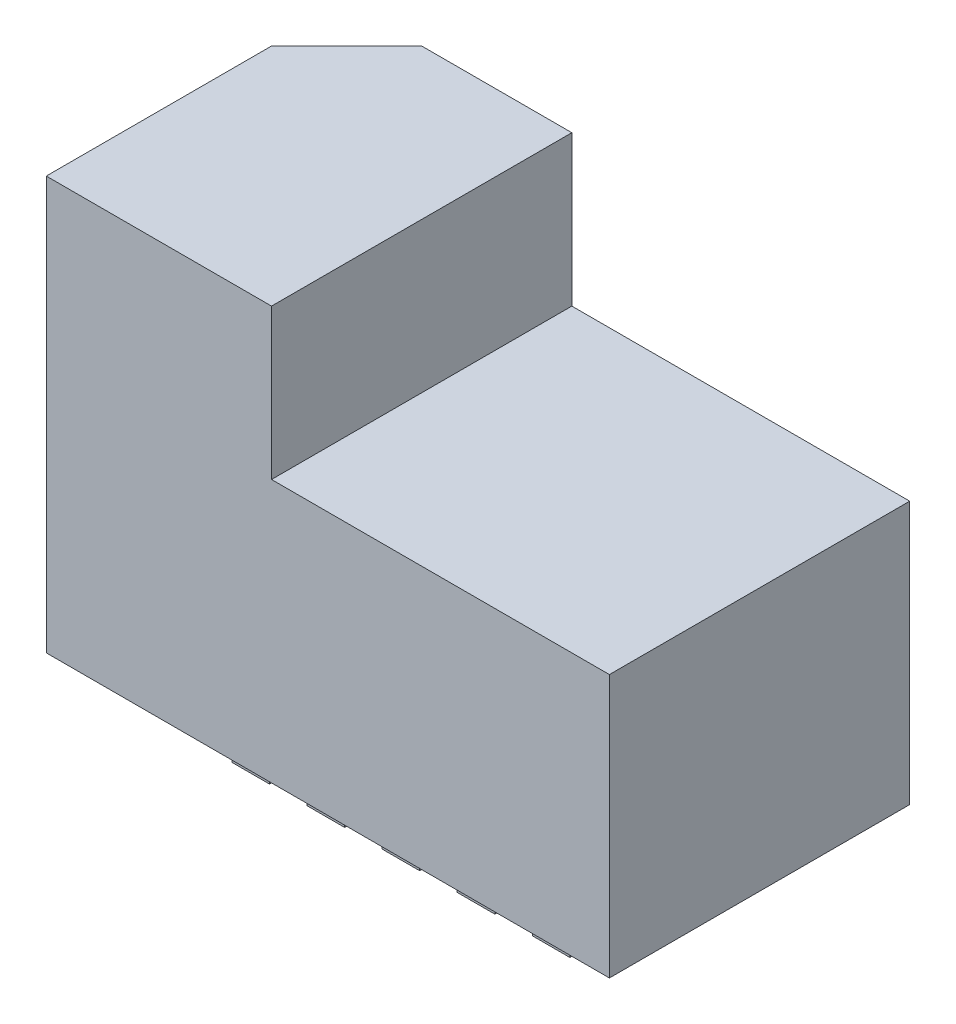
ISO-10303-21;
HEADER;
FILE_DESCRIPTION(('STEP AP214'),'2;1');
FILE_NAME('part.step','',(''),(''),'','','');
FILE_SCHEMA(('AUTOMOTIVE_DESIGN { 1 0 10303 214 1 1 1 1 }'));
ENDSEC;
DATA;
#1=APPLICATION_CONTEXT('core data for automotive mechanical design processes');
#2=APPLICATION_PROTOCOL_DEFINITION('international standard','automotive_design',2000,#1);
#3=PRODUCT_CONTEXT('',#1,'mechanical');
#4=PRODUCT('Part','Part','',(#3));
#5=PRODUCT_RELATED_PRODUCT_CATEGORY('part','',(#4));
#6=PRODUCT_DEFINITION_FORMATION('','',#4);
#7=PRODUCT_DEFINITION_CONTEXT('part definition',#1,'design');
#8=PRODUCT_DEFINITION('design','',#6,#7);
#9=PRODUCT_DEFINITION_SHAPE('','',#8);
#10=(LENGTH_UNIT() NAMED_UNIT(*) SI_UNIT(.MILLI.,.METRE.));
#11=(NAMED_UNIT(*) PLANE_ANGLE_UNIT() SI_UNIT($,.RADIAN.));
#12=(NAMED_UNIT(*) SI_UNIT($,.STERADIAN.) SOLID_ANGLE_UNIT());
#13=UNCERTAINTY_MEASURE_WITH_UNIT(LENGTH_MEASURE(1.E-05),#10,'distance_accuracy_value','');
#14=(GEOMETRIC_REPRESENTATION_CONTEXT(3) GLOBAL_UNCERTAINTY_ASSIGNED_CONTEXT((#13)) GLOBAL_UNIT_ASSIGNED_CONTEXT((#10,
#11,#12)) REPRESENTATION_CONTEXT('',''));
#15=CARTESIAN_POINT('',(0.,0.,0.));
#16=DIRECTION('',(0.,0.,1.));
#17=DIRECTION('',(1.,0.,0.));
#18=AXIS2_PLACEMENT_3D('',#15,#16,#17);
#19=CARTESIAN_POINT('',(0.,0.,0.));
#20=DIRECTION('',(0.,1.,0.));
#21=DIRECTION('',(0.,0.,1.));
#22=AXIS2_PLACEMENT_3D('',#19,#20,#21);
#23=PLANE('',#22);
#24=DIRECTION('',(0.,0.,-1.));
#25=VECTOR('',#24,1.);
#26=CARTESIAN_POINT('',(63.5,0.,-6.01284212611901));
#27=LINE('',#26,#25);
#28=CARTESIAN_POINT('',(63.5,0.,-6.01284212611901));
#29=VERTEX_POINT('',#28);
#30=CARTESIAN_POINT('',(63.5,0.,-44.0360815397835));
#31=VERTEX_POINT('',#30);
#32=EDGE_CURVE('E233',#29,#31,#27,.T.);
#33=ORIENTED_EDGE('',*,*,#32,.F.);
#34=DIRECTION('',(-1.,0.,0.));
#35=VECTOR('',#34,1.);
#36=CARTESIAN_POINT('',(63.5,0.,-6.01284212611901));
#37=LINE('',#36,#35);
#38=CARTESIAN_POINT('',(69.85,0.,-6.01284212611901));
#39=VERTEX_POINT('',#38);
#40=EDGE_CURVE('E246',#39,#29,#37,.T.);
#41=ORIENTED_EDGE('',*,*,#40,.F.);
#42=DIRECTION('',(0.,0.,1.));
#43=VECTOR('',#42,1.);
#44=CARTESIAN_POINT('',(69.85,0.,-6.01284212611901));
#45=LINE('',#44,#43);
#46=CARTESIAN_POINT('',(69.85,0.,-44.0360815397834));
#47=VERTEX_POINT('',#46);
#48=EDGE_CURVE('E255',#47,#39,#45,.T.);
#49=ORIENTED_EDGE('',*,*,#48,.F.);
#50=DIRECTION('',(1.,0.,0.));
#51=VECTOR('',#50,1.);
#52=CARTESIAN_POINT('',(63.5,0.,-44.0360815397835));
#53=LINE('',#52,#51);
#54=EDGE_CURVE('E236',#31,#47,#53,.T.);
#55=ORIENTED_EDGE('',*,*,#54,.F.);
#56=EDGE_LOOP('',(#33,#41,#49,#55));
#57=FACE_BOUND('',#56,.T.);
#58=DIRECTION('',(0.,0.,-1.));
#59=VECTOR('',#58,1.);
#60=CARTESIAN_POINT('',(38.1,0.,-6.01284212611899));
#61=LINE('',#60,#59);
#62=CARTESIAN_POINT('',(38.1,0.,-6.01284212611899));
#63=VERTEX_POINT('',#62);
#64=CARTESIAN_POINT('',(38.1,0.,-44.0360815397834));
#65=VERTEX_POINT('',#64);
#66=EDGE_CURVE('E304',#63,#65,#61,.T.);
#67=ORIENTED_EDGE('',*,*,#66,.F.);
#68=DIRECTION('',(-1.,0.,0.));
#69=VECTOR('',#68,1.);
#70=CARTESIAN_POINT('',(38.1,0.,-6.01284212611899));
#71=LINE('',#70,#69);
#72=CARTESIAN_POINT('',(44.45,0.,-6.01284212611899));
#73=VERTEX_POINT('',#72);
#74=EDGE_CURVE('E309',#73,#63,#71,.T.);
#75=ORIENTED_EDGE('',*,*,#74,.F.);
#76=DIRECTION('',(0.,0.,1.));
#77=VECTOR('',#76,1.);
#78=CARTESIAN_POINT('',(44.45,0.,-6.01284212611899));
#79=LINE('',#78,#77);
#80=CARTESIAN_POINT('',(44.45,0.,-44.0360815397834));
#81=VERTEX_POINT('',#80);
#82=EDGE_CURVE('E321',#81,#73,#79,.T.);
#83=ORIENTED_EDGE('',*,*,#82,.F.);
#84=DIRECTION('',(1.,0.,0.));
#85=VECTOR('',#84,1.);
#86=CARTESIAN_POINT('',(38.1,0.,-44.0360815397834));
#87=LINE('',#86,#85);
#88=EDGE_CURVE('E318',#65,#81,#87,.T.);
#89=ORIENTED_EDGE('',*,*,#88,.F.);
#90=EDGE_LOOP('',(#67,#75,#83,#89));
#91=FACE_BOUND('',#90,.T.);
#92=DIRECTION('',(0.,0.,1.));
#93=VECTOR('',#92,1.);
#94=CARTESIAN_POINT('',(0.,0.,0.));
#95=LINE('',#94,#93);
#96=CARTESIAN_POINT('',(0.,0.,-38.1));
#97=VERTEX_POINT('',#96);
#98=CARTESIAN_POINT('',(0.,0.,0.));
#99=VERTEX_POINT('',#98);
#100=EDGE_CURVE('E389',#97,#99,#95,.T.);
#101=ORIENTED_EDGE('',*,*,#100,.F.);
#102=DIRECTION('',(-0.707106781186548,0.,0.707106781186547));
#103=VECTOR('',#102,1.);
#104=CARTESIAN_POINT('',(0.,0.,-38.1));
#105=LINE('',#104,#103);
#106=CARTESIAN_POINT('',(12.7,0.,-50.8));
#107=VERTEX_POINT('',#106);
#108=EDGE_CURVE('E394',#107,#97,#105,.T.);
#109=ORIENTED_EDGE('',*,*,#108,.F.);
#110=DIRECTION('',(-1.,0.,0.));
#111=VECTOR('',#110,1.);
#112=CARTESIAN_POINT('',(38.1,0.,-50.8));
#113=LINE('',#112,#111);
#114=CARTESIAN_POINT('',(95.25,0.,-50.8));
#115=VERTEX_POINT('',#114);
#116=EDGE_CURVE('E407',#115,#107,#113,.T.);
#117=ORIENTED_EDGE('',*,*,#116,.F.);
#118=DIRECTION('',(0.,0.,-1.));
#119=VECTOR('',#118,1.);
#120=CARTESIAN_POINT('',(95.25,0.,0.));
#121=LINE('',#120,#119);
#122=CARTESIAN_POINT('',(95.25,0.,0.));
#123=VERTEX_POINT('',#122);
#124=EDGE_CURVE('E374',#123,#115,#121,.T.);
#125=ORIENTED_EDGE('',*,*,#124,.F.);
#126=DIRECTION('',(1.,0.,0.));
#127=VECTOR('',#126,1.);
#128=CARTESIAN_POINT('',(0.,0.,0.));
#129=LINE('',#128,#127);
#130=EDGE_CURVE('E405',#99,#123,#129,.T.);
#131=ORIENTED_EDGE('',*,*,#130,.F.);
#132=EDGE_LOOP('',(#101,#109,#117,#125,#131));
#133=FACE_BOUND('',#132,.T.);
#134=DIRECTION('',(0.,0.,-1.));
#135=VECTOR('',#134,1.);
#136=CARTESIAN_POINT('',(25.4,0.,-6.01284212611899));
#137=LINE('',#136,#135);
#138=CARTESIAN_POINT('',(25.4,0.,-6.01284212611899));
#139=VERTEX_POINT('',#138);
#140=CARTESIAN_POINT('',(25.4,0.,-44.0360815397834));
#141=VERTEX_POINT('',#140);
#142=EDGE_CURVE('E337',#139,#141,#137,.T.);
#143=ORIENTED_EDGE('',*,*,#142,.F.);
#144=DIRECTION('',(-1.,0.,0.));
#145=VECTOR('',#144,1.);
#146=CARTESIAN_POINT('',(25.4,0.,-6.01284212611899));
#147=LINE('',#146,#145);
#148=CARTESIAN_POINT('',(31.75,0.,-6.01284212611899));
#149=VERTEX_POINT('',#148);
#150=EDGE_CURVE('E342',#149,#139,#147,.T.);
#151=ORIENTED_EDGE('',*,*,#150,.F.);
#152=DIRECTION('',(0.,0.,1.));
#153=VECTOR('',#152,1.);
#154=CARTESIAN_POINT('',(31.75,0.,-6.01284212611899));
#155=LINE('',#154,#153);
#156=CARTESIAN_POINT('',(31.75,0.,-44.0360815397834));
#157=VERTEX_POINT('',#156);
#158=EDGE_CURVE('E354',#157,#149,#155,.T.);
#159=ORIENTED_EDGE('',*,*,#158,.F.);
#160=DIRECTION('',(1.,0.,0.));
#161=VECTOR('',#160,1.);
#162=CARTESIAN_POINT('',(25.4,0.,-44.0360815397834));
#163=LINE('',#162,#161);
#164=EDGE_CURVE('E351',#141,#157,#163,.T.);
#165=ORIENTED_EDGE('',*,*,#164,.F.);
#166=EDGE_LOOP('',(#143,#151,#159,#165));
#167=FACE_BOUND('',#166,.T.);
#168=DIRECTION('',(0.,0.,-1.));
#169=VECTOR('',#168,1.);
#170=CARTESIAN_POINT('',(50.8,0.,-6.01284212611899));
#171=LINE('',#170,#169);
#172=CARTESIAN_POINT('',(50.8,0.,-6.01284212611899));
#173=VERTEX_POINT('',#172);
#174=CARTESIAN_POINT('',(50.8,0.,-44.0360815397834));
#175=VERTEX_POINT('',#174);
#176=EDGE_CURVE('E271',#173,#175,#171,.T.);
#177=ORIENTED_EDGE('',*,*,#176,.F.);
#178=DIRECTION('',(-1.,0.,0.));
#179=VECTOR('',#178,1.);
#180=CARTESIAN_POINT('',(50.8,0.,-6.01284212611899));
#181=LINE('',#180,#179);
#182=CARTESIAN_POINT('',(57.15,0.,-6.01284212611899));
#183=VERTEX_POINT('',#182);
#184=EDGE_CURVE('E276',#183,#173,#181,.T.);
#185=ORIENTED_EDGE('',*,*,#184,.F.);
#186=DIRECTION('',(0.,0.,1.));
#187=VECTOR('',#186,1.);
#188=CARTESIAN_POINT('',(57.15,0.,-6.01284212611899));
#189=LINE('',#188,#187);
#190=CARTESIAN_POINT('',(57.15,0.,-44.0360815397834));
#191=VERTEX_POINT('',#190);
#192=EDGE_CURVE('E288',#191,#183,#189,.T.);
#193=ORIENTED_EDGE('',*,*,#192,.F.);
#194=DIRECTION('',(1.,0.,0.));
#195=VECTOR('',#194,1.);
#196=CARTESIAN_POINT('',(50.8,0.,-44.0360815397834));
#197=LINE('',#196,#195);
#198=EDGE_CURVE('E285',#175,#191,#197,.T.);
#199=ORIENTED_EDGE('',*,*,#198,.F.);
#200=EDGE_LOOP('',(#177,#185,#193,#199));
#201=FACE_BOUND('',#200,.T.);
#202=DIRECTION('',(0.,0.,-1.));
#203=VECTOR('',#202,1.);
#204=CARTESIAN_POINT('',(76.2,0.,-6.01284212611894));
#205=LINE('',#204,#203);
#206=CARTESIAN_POINT('',(76.2,0.,-6.01284212611894));
#207=VERTEX_POINT('',#206);
#208=CARTESIAN_POINT('',(76.2,0.,-44.0360815397834));
#209=VERTEX_POINT('',#208);
#210=EDGE_CURVE('E232',#207,#209,#205,.T.);
#211=ORIENTED_EDGE('',*,*,#210,.F.);
#212=DIRECTION('',(-1.,0.,0.));
#213=VECTOR('',#212,1.);
#214=CARTESIAN_POINT('',(76.2,0.,-6.01284212611894));
#215=LINE('',#214,#213);
#216=CARTESIAN_POINT('',(82.55,0.,-6.01284212611894));
#217=VERTEX_POINT('',#216);
#218=EDGE_CURVE('E229',#217,#207,#215,.T.);
#219=ORIENTED_EDGE('',*,*,#218,.F.);
#220=DIRECTION('',(0.,0.,1.));
#221=VECTOR('',#220,1.);
#222=CARTESIAN_POINT('',(82.55,0.,-6.01284212611894));
#223=LINE('',#222,#221);
#224=CARTESIAN_POINT('',(82.55,0.,-44.0360815397834));
#225=VERTEX_POINT('',#224);
#226=EDGE_CURVE('E53',#225,#217,#223,.T.);
#227=ORIENTED_EDGE('',*,*,#226,.F.);
#228=DIRECTION('',(1.,0.,0.));
#229=VECTOR('',#228,1.);
#230=CARTESIAN_POINT('',(76.2,0.,-44.0360815397834));
#231=LINE('',#230,#229);
#232=EDGE_CURVE('E48',#209,#225,#231,.T.);
#233=ORIENTED_EDGE('',*,*,#232,.F.);
#234=EDGE_LOOP('',(#211,#219,#227,#233));
#235=FACE_BOUND('',#234,.T.);
#236=ADVANCED_FACE('F33',(#57,#91,#133,#167,#201,#235),#23,.F.);
#237=CARTESIAN_POINT('',(38.1,69.85,0.));
#238=DIRECTION('',(-1.,0.,0.));
#239=DIRECTION('',(0.,0.,1.));
#240=AXIS2_PLACEMENT_3D('',#237,#238,#239);
#241=PLANE('',#240);
#242=DIRECTION('',(0.,0.,1.));
#243=VECTOR('',#242,1.);
#244=CARTESIAN_POINT('',(38.1,44.45,0.));
#245=LINE('',#244,#243);
#246=CARTESIAN_POINT('',(38.1,44.45,-50.8));
#247=VERTEX_POINT('',#246);
#248=CARTESIAN_POINT('',(38.1,44.45,0.));
#249=VERTEX_POINT('',#248);
#250=EDGE_CURVE('E370',#247,#249,#245,.T.);
#251=ORIENTED_EDGE('',*,*,#250,.F.);
#252=DIRECTION('',(0.,-1.,0.));
#253=VECTOR('',#252,1.);
#254=CARTESIAN_POINT('',(38.1,69.85,-50.8));
#255=LINE('',#254,#253);
#256=CARTESIAN_POINT('',(38.1,69.85,-50.8));
#257=VERTEX_POINT('',#256);
#258=EDGE_CURVE('E415',#257,#247,#255,.T.);
#259=ORIENTED_EDGE('',*,*,#258,.F.);
#260=DIRECTION('',(0.,0.,-1.));
#261=VECTOR('',#260,1.);
#262=CARTESIAN_POINT('',(38.1,69.85,0.));
#263=LINE('',#262,#261);
#264=CARTESIAN_POINT('',(38.1,69.85,0.));
#265=VERTEX_POINT('',#264);
#266=EDGE_CURVE('E396',#265,#257,#263,.T.);
#267=ORIENTED_EDGE('',*,*,#266,.F.);
#268=DIRECTION('',(0.,-1.,0.));
#269=VECTOR('',#268,1.);
#270=CARTESIAN_POINT('',(38.1,69.85,0.));
#271=LINE('',#270,#269);
#272=EDGE_CURVE('E41',#265,#249,#271,.T.);
#273=ORIENTED_EDGE('',*,*,#272,.T.);
#274=EDGE_LOOP('',(#251,#259,#267,#273));
#275=FACE_BOUND('',#274,.T.);
#276=ADVANCED_FACE('F420',(#275),#241,.F.);
#277=CARTESIAN_POINT('',(0.,69.85,0.));
#278=DIRECTION('',(1.,0.,0.));
#279=DIRECTION('',(0.,0.,-1.));
#280=AXIS2_PLACEMENT_3D('',#277,#278,#279);
#281=PLANE('',#280);
#282=ORIENTED_EDGE('',*,*,#100,.T.);
#283=DIRECTION('',(0.,-1.,0.));
#284=VECTOR('',#283,1.);
#285=CARTESIAN_POINT('',(0.,69.85,0.));
#286=LINE('',#285,#284);
#287=CARTESIAN_POINT('',(0.,69.85,0.));
#288=VERTEX_POINT('',#287);
#289=EDGE_CURVE('E11',#288,#99,#286,.T.);
#290=ORIENTED_EDGE('',*,*,#289,.F.);
#291=DIRECTION('',(0.,0.,1.));
#292=VECTOR('',#291,1.);
#293=CARTESIAN_POINT('',(0.,69.85,0.));
#294=LINE('',#293,#292);
#295=CARTESIAN_POINT('',(0.,69.85,-38.1));
#296=VERTEX_POINT('',#295);
#297=EDGE_CURVE('E390',#296,#288,#294,.T.);
#298=ORIENTED_EDGE('',*,*,#297,.F.);
#299=DIRECTION('',(0.,-1.,0.));
#300=VECTOR('',#299,1.);
#301=CARTESIAN_POINT('',(0.,69.85,-38.1));
#302=LINE('',#301,#300);
#303=EDGE_CURVE('E402',#296,#97,#302,.T.);
#304=ORIENTED_EDGE('',*,*,#303,.T.);
#305=EDGE_LOOP('',(#282,#290,#298,#304));
#306=FACE_BOUND('',#305,.T.);
#307=ADVANCED_FACE('F35',(#306),#281,.F.);
#308=CARTESIAN_POINT('',(0.,69.85,0.));
#309=DIRECTION('',(0.,0.,-1.));
#310=DIRECTION('',(-1.,0.,0.));
#311=AXIS2_PLACEMENT_3D('',#308,#309,#310);
#312=PLANE('',#311);
#313=ORIENTED_EDGE('',*,*,#130,.T.);
#314=DIRECTION('',(0.,-1.,0.));
#315=VECTOR('',#314,1.);
#316=CARTESIAN_POINT('',(95.25,0.,0.));
#317=LINE('',#316,#315);
#318=CARTESIAN_POINT('',(95.25,44.45,0.));
#319=VERTEX_POINT('',#318);
#320=EDGE_CURVE('E371',#319,#123,#317,.T.);
#321=ORIENTED_EDGE('',*,*,#320,.F.);
#322=DIRECTION('',(-1.,0.,0.));
#323=VECTOR('',#322,1.);
#324=CARTESIAN_POINT('',(95.25,44.45,0.));
#325=LINE('',#324,#323);
#326=EDGE_CURVE('E381',#319,#249,#325,.T.);
#327=ORIENTED_EDGE('',*,*,#326,.T.);
#328=ORIENTED_EDGE('',*,*,#272,.F.);
#329=DIRECTION('',(1.,0.,0.));
#330=VECTOR('',#329,1.);
#331=CARTESIAN_POINT('',(0.,69.85,0.));
#332=LINE('',#331,#330);
#333=EDGE_CURVE('E393',#288,#265,#332,.T.);
#334=ORIENTED_EDGE('',*,*,#333,.F.);
#335=ORIENTED_EDGE('',*,*,#289,.T.);
#336=EDGE_LOOP('',(#313,#321,#327,#328,#334,#335));
#337=FACE_BOUND('',#336,.T.);
#338=ADVANCED_FACE('F429',(#337),#312,.F.);
#339=CARTESIAN_POINT('',(38.1,69.85,-50.8));
#340=DIRECTION('',(0.,0.,1.));
#341=DIRECTION('',(1.,0.,0.));
#342=AXIS2_PLACEMENT_3D('',#339,#340,#341);
#343=PLANE('',#342);
#344=ORIENTED_EDGE('',*,*,#116,.T.);
#345=DIRECTION('',(0.,-1.,0.));
#346=VECTOR('',#345,1.);
#347=CARTESIAN_POINT('',(12.7,69.85,-50.8));
#348=LINE('',#347,#346);
#349=CARTESIAN_POINT('',(12.7,69.85,-50.8));
#350=VERTEX_POINT('',#349);
#351=EDGE_CURVE('E412',#350,#107,#348,.T.);
#352=ORIENTED_EDGE('',*,*,#351,.F.);
#353=DIRECTION('',(-1.,0.,0.));
#354=VECTOR('',#353,1.);
#355=CARTESIAN_POINT('',(38.1,69.85,-50.8));
#356=LINE('',#355,#354);
#357=EDGE_CURVE('E398',#257,#350,#356,.T.);
#358=ORIENTED_EDGE('',*,*,#357,.F.);
#359=ORIENTED_EDGE('',*,*,#258,.T.);
#360=DIRECTION('',(-1.,0.,0.));
#361=VECTOR('',#360,1.);
#362=CARTESIAN_POINT('',(95.25,44.45,-50.8));
#363=LINE('',#362,#361);
#364=CARTESIAN_POINT('',(95.25,44.45,-50.8));
#365=VERTEX_POINT('',#364);
#366=EDGE_CURVE('E386',#365,#247,#363,.T.);
#367=ORIENTED_EDGE('',*,*,#366,.F.);
#368=DIRECTION('',(0.,1.,0.));
#369=VECTOR('',#368,1.);
#370=CARTESIAN_POINT('',(95.25,0.,-50.8));
#371=LINE('',#370,#369);
#372=EDGE_CURVE('E377',#115,#365,#371,.T.);
#373=ORIENTED_EDGE('',*,*,#372,.F.);
#374=EDGE_LOOP('',(#344,#352,#358,#359,#367,#373));
#375=FACE_BOUND('',#374,.T.);
#376=ADVANCED_FACE('F435',(#375),#343,.F.);
#377=CARTESIAN_POINT('',(0.,69.85,-38.1));
#378=DIRECTION('',(0.707106781186547,0.,0.707106781186548));
#379=DIRECTION('',(0.707106781186548,0.,-0.707106781186547));
#380=AXIS2_PLACEMENT_3D('',#377,#378,#379);
#381=PLANE('',#380);
#382=ORIENTED_EDGE('',*,*,#108,.T.);
#383=ORIENTED_EDGE('',*,*,#303,.F.);
#384=DIRECTION('',(-0.707106781186548,0.,0.707106781186547));
#385=VECTOR('',#384,1.);
#386=CARTESIAN_POINT('',(0.,69.85,-38.1));
#387=LINE('',#386,#385);
#388=EDGE_CURVE('E400',#350,#296,#387,.T.);
#389=ORIENTED_EDGE('',*,*,#388,.F.);
#390=ORIENTED_EDGE('',*,*,#351,.T.);
#391=EDGE_LOOP('',(#382,#383,#389,#390));
#392=FACE_BOUND('',#391,.T.);
#393=ADVANCED_FACE('F450',(#392),#381,.F.);
#394=CARTESIAN_POINT('',(0.,69.85,0.));
#395=DIRECTION('',(0.,1.,0.));
#396=DIRECTION('',(0.,0.,1.));
#397=AXIS2_PLACEMENT_3D('',#394,#395,#396);
#398=PLANE('',#397);
#399=ORIENTED_EDGE('',*,*,#297,.T.);
#400=ORIENTED_EDGE('',*,*,#333,.T.);
#401=ORIENTED_EDGE('',*,*,#266,.T.);
#402=ORIENTED_EDGE('',*,*,#357,.T.);
#403=ORIENTED_EDGE('',*,*,#388,.T.);
#404=EDGE_LOOP('',(#399,#400,#401,#402,#403));
#405=FACE_BOUND('',#404,.T.);
#406=ADVANCED_FACE('F440',(#405),#398,.T.);
#407=CARTESIAN_POINT('',(95.25,44.45,0.));
#408=DIRECTION('',(0.,-1.,0.));
#409=DIRECTION('',(0.,0.,-1.));
#410=AXIS2_PLACEMENT_3D('',#407,#408,#409);
#411=PLANE('',#410);
#412=ORIENTED_EDGE('',*,*,#250,.T.);
#413=ORIENTED_EDGE('',*,*,#326,.F.);
#414=DIRECTION('',(0.,0.,1.));
#415=VECTOR('',#414,1.);
#416=CARTESIAN_POINT('',(95.25,44.45,0.));
#417=LINE('',#416,#415);
#418=EDGE_CURVE('E379',#365,#319,#417,.T.);
#419=ORIENTED_EDGE('',*,*,#418,.F.);
#420=ORIENTED_EDGE('',*,*,#366,.T.);
#421=EDGE_LOOP('',(#412,#413,#419,#420));
#422=FACE_BOUND('',#421,.T.);
#423=ADVANCED_FACE('F425',(#422),#411,.F.);
#424=CARTESIAN_POINT('',(95.25,0.,0.));
#425=DIRECTION('',(-1.,0.,0.));
#426=DIRECTION('',(0.,0.,1.));
#427=AXIS2_PLACEMENT_3D('',#424,#425,#426);
#428=PLANE('',#427);
#429=ORIENTED_EDGE('',*,*,#320,.T.);
#430=ORIENTED_EDGE('',*,*,#124,.T.);
#431=ORIENTED_EDGE('',*,*,#372,.T.);
#432=ORIENTED_EDGE('',*,*,#418,.T.);
#433=EDGE_LOOP('',(#429,#430,#431,#432));
#434=FACE_BOUND('',#433,.T.);
#435=ADVANCED_FACE('F432',(#434),#428,.F.);
#436=CARTESIAN_POINT('',(25.4,-6.35,-6.01284212611899));
#437=DIRECTION('',(1.,0.,0.));
#438=DIRECTION('',(0.,0.,-1.));
#439=AXIS2_PLACEMENT_3D('',#436,#437,#438);
#440=PLANE('',#439);
#441=ORIENTED_EDGE('',*,*,#142,.T.);
#442=DIRECTION('',(0.,1.,0.));
#443=VECTOR('',#442,1.);
#444=CARTESIAN_POINT('',(25.4,-6.35,-44.0360815397834));
#445=LINE('',#444,#443);
#446=CARTESIAN_POINT('',(25.4,-6.35,-44.0360815397834));
#447=VERTEX_POINT('',#446);
#448=EDGE_CURVE('E367',#447,#141,#445,.T.);
#449=ORIENTED_EDGE('',*,*,#448,.F.);
#450=DIRECTION('',(0.,0.,-1.));
#451=VECTOR('',#450,1.);
#452=CARTESIAN_POINT('',(25.4,-6.35,-6.01284212611899));
#453=LINE('',#452,#451);
#454=CARTESIAN_POINT('',(25.4,-6.35,-6.01284212611899));
#455=VERTEX_POINT('',#454);
#456=EDGE_CURVE('E338',#455,#447,#453,.T.);
#457=ORIENTED_EDGE('',*,*,#456,.F.);
#458=DIRECTION('',(0.,1.,0.));
#459=VECTOR('',#458,1.);
#460=CARTESIAN_POINT('',(25.4,-6.35,-6.01284212611899));
#461=LINE('',#460,#459);
#462=EDGE_CURVE('E348',#455,#139,#461,.T.);
#463=ORIENTED_EDGE('',*,*,#462,.T.);
#464=EDGE_LOOP('',(#441,#449,#457,#463));
#465=FACE_BOUND('',#464,.T.);
#466=ADVANCED_FACE('F472',(#465),#440,.F.);
#467=CARTESIAN_POINT('',(25.4,-6.35,-44.0360815397834));
#468=DIRECTION('',(0.,0.,1.));
#469=DIRECTION('',(1.,0.,0.));
#470=AXIS2_PLACEMENT_3D('',#467,#468,#469);
#471=PLANE('',#470);
#472=ORIENTED_EDGE('',*,*,#164,.T.);
#473=DIRECTION('',(0.,1.,0.));
#474=VECTOR('',#473,1.);
#475=CARTESIAN_POINT('',(31.75,-6.35,-44.0360815397834));
#476=LINE('',#475,#474);
#477=CARTESIAN_POINT('',(31.75,-6.35,-44.0360815397834));
#478=VERTEX_POINT('',#477);
#479=EDGE_CURVE('E364',#478,#157,#476,.T.);
#480=ORIENTED_EDGE('',*,*,#479,.F.);
#481=DIRECTION('',(1.,0.,0.));
#482=VECTOR('',#481,1.);
#483=CARTESIAN_POINT('',(25.4,-6.35,-44.0360815397834));
#484=LINE('',#483,#482);
#485=EDGE_CURVE('E341',#447,#478,#484,.T.);
#486=ORIENTED_EDGE('',*,*,#485,.F.);
#487=ORIENTED_EDGE('',*,*,#448,.T.);
#488=EDGE_LOOP('',(#472,#480,#486,#487));
#489=FACE_BOUND('',#488,.T.);
#490=ADVANCED_FACE('F475',(#489),#471,.F.);
#491=CARTESIAN_POINT('',(31.75,-6.35,-6.01284212611899));
#492=DIRECTION('',(-1.,0.,0.));
#493=DIRECTION('',(0.,0.,1.));
#494=AXIS2_PLACEMENT_3D('',#491,#492,#493);
#495=PLANE('',#494);
#496=ORIENTED_EDGE('',*,*,#158,.T.);
#497=DIRECTION('',(0.,1.,0.));
#498=VECTOR('',#497,1.);
#499=CARTESIAN_POINT('',(31.75,-6.35,-6.01284212611899));
#500=LINE('',#499,#498);
#501=CARTESIAN_POINT('',(31.75,-6.35,-6.01284212611899));
#502=VERTEX_POINT('',#501);
#503=EDGE_CURVE('E361',#502,#149,#500,.T.);
#504=ORIENTED_EDGE('',*,*,#503,.F.);
#505=DIRECTION('',(0.,0.,1.));
#506=VECTOR('',#505,1.);
#507=CARTESIAN_POINT('',(31.75,-6.35,-6.01284212611899));
#508=LINE('',#507,#506);
#509=EDGE_CURVE('E344',#478,#502,#508,.T.);
#510=ORIENTED_EDGE('',*,*,#509,.F.);
#511=ORIENTED_EDGE('',*,*,#479,.T.);
#512=EDGE_LOOP('',(#496,#504,#510,#511));
#513=FACE_BOUND('',#512,.T.);
#514=ADVANCED_FACE('F479',(#513),#495,.F.);
#515=CARTESIAN_POINT('',(25.4,-6.35,-6.01284212611899));
#516=DIRECTION('',(0.,0.,-1.));
#517=DIRECTION('',(-1.,0.,0.));
#518=AXIS2_PLACEMENT_3D('',#515,#516,#517);
#519=PLANE('',#518);
#520=ORIENTED_EDGE('',*,*,#150,.T.);
#521=ORIENTED_EDGE('',*,*,#462,.F.);
#522=DIRECTION('',(-1.,0.,0.));
#523=VECTOR('',#522,1.);
#524=CARTESIAN_POINT('',(25.4,-6.35,-6.01284212611899));
#525=LINE('',#524,#523);
#526=EDGE_CURVE('E346',#502,#455,#525,.T.);
#527=ORIENTED_EDGE('',*,*,#526,.F.);
#528=ORIENTED_EDGE('',*,*,#503,.T.);
#529=EDGE_LOOP('',(#520,#521,#527,#528));
#530=FACE_BOUND('',#529,.T.);
#531=ADVANCED_FACE('F483',(#530),#519,.F.);
#532=CARTESIAN_POINT('',(0.,-6.35,0.));
#533=DIRECTION('',(0.,-1.,0.));
#534=DIRECTION('',(0.,0.,-1.));
#535=AXIS2_PLACEMENT_3D('',#532,#533,#534);
#536=PLANE('',#535);
#537=ORIENTED_EDGE('',*,*,#456,.T.);
#538=ORIENTED_EDGE('',*,*,#485,.T.);
#539=ORIENTED_EDGE('',*,*,#509,.T.);
#540=ORIENTED_EDGE('',*,*,#526,.T.);
#541=EDGE_LOOP('',(#537,#538,#539,#540));
#542=FACE_BOUND('',#541,.T.);
#543=ADVANCED_FACE('F487',(#542),#536,.T.);
#544=CARTESIAN_POINT('',(38.1,-6.35,-6.01284212611899));
#545=DIRECTION('',(1.,0.,0.));
#546=DIRECTION('',(0.,0.,-1.));
#547=AXIS2_PLACEMENT_3D('',#544,#545,#546);
#548=PLANE('',#547);
#549=ORIENTED_EDGE('',*,*,#66,.T.);
#550=DIRECTION('',(0.,1.,0.));
#551=VECTOR('',#550,1.);
#552=CARTESIAN_POINT('',(38.1,-6.35,-44.0360815397834));
#553=LINE('',#552,#551);
#554=CARTESIAN_POINT('',(38.1,-6.35,-44.0360815397834));
#555=VERTEX_POINT('',#554);
#556=EDGE_CURVE('E334',#555,#65,#553,.T.);
#557=ORIENTED_EDGE('',*,*,#556,.F.);
#558=DIRECTION('',(0.,0.,-1.));
#559=VECTOR('',#558,1.);
#560=CARTESIAN_POINT('',(38.1,-6.35,-6.01284212611899));
#561=LINE('',#560,#559);
#562=CARTESIAN_POINT('',(38.1,-6.35,-6.01284212611899));
#563=VERTEX_POINT('',#562);
#564=EDGE_CURVE('E305',#563,#555,#561,.T.);
#565=ORIENTED_EDGE('',*,*,#564,.F.);
#566=DIRECTION('',(0.,1.,0.));
#567=VECTOR('',#566,1.);
#568=CARTESIAN_POINT('',(38.1,-6.35,-6.01284212611899));
#569=LINE('',#568,#567);
#570=EDGE_CURVE('E315',#563,#63,#569,.T.);
#571=ORIENTED_EDGE('',*,*,#570,.T.);
#572=EDGE_LOOP('',(#549,#557,#565,#571));
#573=FACE_BOUND('',#572,.T.);
#574=ADVANCED_FACE('F491',(#573),#548,.F.);
#575=CARTESIAN_POINT('',(38.1,-6.35,-44.0360815397834));
#576=DIRECTION('',(0.,0.,1.));
#577=DIRECTION('',(1.,0.,0.));
#578=AXIS2_PLACEMENT_3D('',#575,#576,#577);
#579=PLANE('',#578);
#580=ORIENTED_EDGE('',*,*,#88,.T.);
#581=DIRECTION('',(0.,1.,0.));
#582=VECTOR('',#581,1.);
#583=CARTESIAN_POINT('',(44.45,-6.35,-44.0360815397834));
#584=LINE('',#583,#582);
#585=CARTESIAN_POINT('',(44.45,-6.35,-44.0360815397834));
#586=VERTEX_POINT('',#585);
#587=EDGE_CURVE('E331',#586,#81,#584,.T.);
#588=ORIENTED_EDGE('',*,*,#587,.F.);
#589=DIRECTION('',(1.,0.,0.));
#590=VECTOR('',#589,1.);
#591=CARTESIAN_POINT('',(38.1,-6.35,-44.0360815397834));
#592=LINE('',#591,#590);
#593=EDGE_CURVE('E308',#555,#586,#592,.T.);
#594=ORIENTED_EDGE('',*,*,#593,.F.);
#595=ORIENTED_EDGE('',*,*,#556,.T.);
#596=EDGE_LOOP('',(#580,#588,#594,#595));
#597=FACE_BOUND('',#596,.T.);
#598=ADVANCED_FACE('F495',(#597),#579,.F.);
#599=CARTESIAN_POINT('',(44.45,-6.35,-6.01284212611899));
#600=DIRECTION('',(-1.,0.,0.));
#601=DIRECTION('',(0.,0.,1.));
#602=AXIS2_PLACEMENT_3D('',#599,#600,#601);
#603=PLANE('',#602);
#604=ORIENTED_EDGE('',*,*,#82,.T.);
#605=DIRECTION('',(0.,1.,0.));
#606=VECTOR('',#605,1.);
#607=CARTESIAN_POINT('',(44.45,-6.35,-6.01284212611899));
#608=LINE('',#607,#606);
#609=CARTESIAN_POINT('',(44.45,-6.35,-6.01284212611899));
#610=VERTEX_POINT('',#609);
#611=EDGE_CURVE('E328',#610,#73,#608,.T.);
#612=ORIENTED_EDGE('',*,*,#611,.F.);
#613=DIRECTION('',(0.,0.,1.));
#614=VECTOR('',#613,1.);
#615=CARTESIAN_POINT('',(44.45,-6.35,-6.01284212611899));
#616=LINE('',#615,#614);
#617=EDGE_CURVE('E311',#586,#610,#616,.T.);
#618=ORIENTED_EDGE('',*,*,#617,.F.);
#619=ORIENTED_EDGE('',*,*,#587,.T.);
#620=EDGE_LOOP('',(#604,#612,#618,#619));
#621=FACE_BOUND('',#620,.T.);
#622=ADVANCED_FACE('F499',(#621),#603,.F.);
#623=CARTESIAN_POINT('',(38.1,-6.35,-6.01284212611899));
#624=DIRECTION('',(0.,0.,-1.));
#625=DIRECTION('',(-1.,0.,0.));
#626=AXIS2_PLACEMENT_3D('',#623,#624,#625);
#627=PLANE('',#626);
#628=ORIENTED_EDGE('',*,*,#74,.T.);
#629=ORIENTED_EDGE('',*,*,#570,.F.);
#630=DIRECTION('',(-1.,0.,0.));
#631=VECTOR('',#630,1.);
#632=CARTESIAN_POINT('',(38.1,-6.35,-6.01284212611899));
#633=LINE('',#632,#631);
#634=EDGE_CURVE('E313',#610,#563,#633,.T.);
#635=ORIENTED_EDGE('',*,*,#634,.F.);
#636=ORIENTED_EDGE('',*,*,#611,.T.);
#637=EDGE_LOOP('',(#628,#629,#635,#636));
#638=FACE_BOUND('',#637,.T.);
#639=ADVANCED_FACE('F503',(#638),#627,.F.);
#640=CARTESIAN_POINT('',(0.,-6.35,0.));
#641=DIRECTION('',(0.,-1.,0.));
#642=DIRECTION('',(0.,0.,-1.));
#643=AXIS2_PLACEMENT_3D('',#640,#641,#642);
#644=PLANE('',#643);
#645=ORIENTED_EDGE('',*,*,#564,.T.);
#646=ORIENTED_EDGE('',*,*,#593,.T.);
#647=ORIENTED_EDGE('',*,*,#617,.T.);
#648=ORIENTED_EDGE('',*,*,#634,.T.);
#649=EDGE_LOOP('',(#645,#646,#647,#648));
#650=FACE_BOUND('',#649,.T.);
#651=ADVANCED_FACE('F507',(#650),#644,.T.);
#652=CARTESIAN_POINT('',(50.8,-6.35,-6.01284212611899));
#653=DIRECTION('',(1.,0.,0.));
#654=DIRECTION('',(0.,0.,-1.));
#655=AXIS2_PLACEMENT_3D('',#652,#653,#654);
#656=PLANE('',#655);
#657=ORIENTED_EDGE('',*,*,#176,.T.);
#658=DIRECTION('',(0.,1.,0.));
#659=VECTOR('',#658,1.);
#660=CARTESIAN_POINT('',(50.8,-6.35,-44.0360815397834));
#661=LINE('',#660,#659);
#662=CARTESIAN_POINT('',(50.8,-6.35,-44.0360815397834));
#663=VERTEX_POINT('',#662);
#664=EDGE_CURVE('E301',#663,#175,#661,.T.);
#665=ORIENTED_EDGE('',*,*,#664,.F.);
#666=DIRECTION('',(0.,0.,-1.));
#667=VECTOR('',#666,1.);
#668=CARTESIAN_POINT('',(50.8,-6.35,-6.01284212611899));
#669=LINE('',#668,#667);
#670=CARTESIAN_POINT('',(50.8,-6.35,-6.01284212611899));
#671=VERTEX_POINT('',#670);
#672=EDGE_CURVE('E272',#671,#663,#669,.T.);
#673=ORIENTED_EDGE('',*,*,#672,.F.);
#674=DIRECTION('',(0.,1.,0.));
#675=VECTOR('',#674,1.);
#676=CARTESIAN_POINT('',(50.8,-6.35,-6.01284212611899));
#677=LINE('',#676,#675);
#678=EDGE_CURVE('E282',#671,#173,#677,.T.);
#679=ORIENTED_EDGE('',*,*,#678,.T.);
#680=EDGE_LOOP('',(#657,#665,#673,#679));
#681=FACE_BOUND('',#680,.T.);
#682=ADVANCED_FACE('F511',(#681),#656,.F.);
#683=CARTESIAN_POINT('',(50.8,-6.35,-44.0360815397834));
#684=DIRECTION('',(0.,0.,1.));
#685=DIRECTION('',(1.,0.,0.));
#686=AXIS2_PLACEMENT_3D('',#683,#684,#685);
#687=PLANE('',#686);
#688=ORIENTED_EDGE('',*,*,#198,.T.);
#689=DIRECTION('',(0.,1.,0.));
#690=VECTOR('',#689,1.);
#691=CARTESIAN_POINT('',(57.15,-6.35,-44.0360815397834));
#692=LINE('',#691,#690);
#693=CARTESIAN_POINT('',(57.15,-6.35,-44.0360815397834));
#694=VERTEX_POINT('',#693);
#695=EDGE_CURVE('E298',#694,#191,#692,.T.);
#696=ORIENTED_EDGE('',*,*,#695,.F.);
#697=DIRECTION('',(1.,0.,0.));
#698=VECTOR('',#697,1.);
#699=CARTESIAN_POINT('',(50.8,-6.35,-44.0360815397834));
#700=LINE('',#699,#698);
#701=EDGE_CURVE('E275',#663,#694,#700,.T.);
#702=ORIENTED_EDGE('',*,*,#701,.F.);
#703=ORIENTED_EDGE('',*,*,#664,.T.);
#704=EDGE_LOOP('',(#688,#696,#702,#703));
#705=FACE_BOUND('',#704,.T.);
#706=ADVANCED_FACE('F515',(#705),#687,.F.);
#707=CARTESIAN_POINT('',(57.15,-6.35,-6.01284212611899));
#708=DIRECTION('',(-1.,0.,0.));
#709=DIRECTION('',(0.,0.,1.));
#710=AXIS2_PLACEMENT_3D('',#707,#708,#709);
#711=PLANE('',#710);
#712=ORIENTED_EDGE('',*,*,#192,.T.);
#713=DIRECTION('',(0.,1.,0.));
#714=VECTOR('',#713,1.);
#715=CARTESIAN_POINT('',(57.15,-6.35,-6.01284212611899));
#716=LINE('',#715,#714);
#717=CARTESIAN_POINT('',(57.15,-6.35,-6.01284212611899));
#718=VERTEX_POINT('',#717);
#719=EDGE_CURVE('E295',#718,#183,#716,.T.);
#720=ORIENTED_EDGE('',*,*,#719,.F.);
#721=DIRECTION('',(0.,0.,1.));
#722=VECTOR('',#721,1.);
#723=CARTESIAN_POINT('',(57.15,-6.35,-6.01284212611899));
#724=LINE('',#723,#722);
#725=EDGE_CURVE('E278',#694,#718,#724,.T.);
#726=ORIENTED_EDGE('',*,*,#725,.F.);
#727=ORIENTED_EDGE('',*,*,#695,.T.);
#728=EDGE_LOOP('',(#712,#720,#726,#727));
#729=FACE_BOUND('',#728,.T.);
#730=ADVANCED_FACE('F519',(#729),#711,.F.);
#731=CARTESIAN_POINT('',(50.8,-6.35,-6.01284212611899));
#732=DIRECTION('',(0.,0.,-1.));
#733=DIRECTION('',(-1.,0.,0.));
#734=AXIS2_PLACEMENT_3D('',#731,#732,#733);
#735=PLANE('',#734);
#736=ORIENTED_EDGE('',*,*,#184,.T.);
#737=ORIENTED_EDGE('',*,*,#678,.F.);
#738=DIRECTION('',(-1.,0.,0.));
#739=VECTOR('',#738,1.);
#740=CARTESIAN_POINT('',(50.8,-6.35,-6.01284212611899));
#741=LINE('',#740,#739);
#742=EDGE_CURVE('E280',#718,#671,#741,.T.);
#743=ORIENTED_EDGE('',*,*,#742,.F.);
#744=ORIENTED_EDGE('',*,*,#719,.T.);
#745=EDGE_LOOP('',(#736,#737,#743,#744));
#746=FACE_BOUND('',#745,.T.);
#747=ADVANCED_FACE('F523',(#746),#735,.F.);
#748=CARTESIAN_POINT('',(0.,-6.35,0.));
#749=DIRECTION('',(0.,-1.,0.));
#750=DIRECTION('',(0.,0.,-1.));
#751=AXIS2_PLACEMENT_3D('',#748,#749,#750);
#752=PLANE('',#751);
#753=ORIENTED_EDGE('',*,*,#672,.T.);
#754=ORIENTED_EDGE('',*,*,#701,.T.);
#755=ORIENTED_EDGE('',*,*,#725,.T.);
#756=ORIENTED_EDGE('',*,*,#742,.T.);
#757=EDGE_LOOP('',(#753,#754,#755,#756));
#758=FACE_BOUND('',#757,.T.);
#759=ADVANCED_FACE('F527',(#758),#752,.T.);
#760=CARTESIAN_POINT('',(63.5,-6.35,-6.01284212611901));
#761=DIRECTION('',(1.,0.,0.));
#762=DIRECTION('',(0.,0.,-1.));
#763=AXIS2_PLACEMENT_3D('',#760,#761,#762);
#764=PLANE('',#763);
#765=ORIENTED_EDGE('',*,*,#32,.T.);
#766=DIRECTION('',(0.,1.,0.));
#767=VECTOR('',#766,1.);
#768=CARTESIAN_POINT('',(63.5,-6.35,-44.0360815397835));
#769=LINE('',#768,#767);
#770=CARTESIAN_POINT('',(63.5,-6.35,-44.0360815397835));
#771=VERTEX_POINT('',#770);
#772=EDGE_CURVE('E268',#771,#31,#769,.T.);
#773=ORIENTED_EDGE('',*,*,#772,.F.);
#774=DIRECTION('',(0.,0.,-1.));
#775=VECTOR('',#774,1.);
#776=CARTESIAN_POINT('',(63.5,-6.35,-6.01284212611901));
#777=LINE('',#776,#775);
#778=CARTESIAN_POINT('',(63.5,-6.35,-6.01284212611901));
#779=VERTEX_POINT('',#778);
#780=EDGE_CURVE('E242',#779,#771,#777,.T.);
#781=ORIENTED_EDGE('',*,*,#780,.F.);
#782=DIRECTION('',(0.,1.,0.));
#783=VECTOR('',#782,1.);
#784=CARTESIAN_POINT('',(63.5,-6.35,-6.01284212611901));
#785=LINE('',#784,#783);
#786=EDGE_CURVE('E251',#779,#29,#785,.T.);
#787=ORIENTED_EDGE('',*,*,#786,.T.);
#788=EDGE_LOOP('',(#765,#773,#781,#787));
#789=FACE_BOUND('',#788,.T.);
#790=ADVANCED_FACE('F531',(#789),#764,.F.);
#791=CARTESIAN_POINT('',(63.5,-6.35,-44.0360815397835));
#792=DIRECTION('',(0.,0.,1.));
#793=DIRECTION('',(1.,0.,0.));
#794=AXIS2_PLACEMENT_3D('',#791,#792,#793);
#795=PLANE('',#794);
#796=ORIENTED_EDGE('',*,*,#54,.T.);
#797=DIRECTION('',(0.,1.,0.));
#798=VECTOR('',#797,1.);
#799=CARTESIAN_POINT('',(69.85,-6.35,-44.0360815397834));
#800=LINE('',#799,#798);
#801=CARTESIAN_POINT('',(69.85,-6.35,-44.0360815397834));
#802=VERTEX_POINT('',#801);
#803=EDGE_CURVE('E265',#802,#47,#800,.T.);
#804=ORIENTED_EDGE('',*,*,#803,.F.);
#805=DIRECTION('',(1.,0.,0.));
#806=VECTOR('',#805,1.);
#807=CARTESIAN_POINT('',(63.5,-6.35,-44.0360815397835));
#808=LINE('',#807,#806);
#809=EDGE_CURVE('E245',#771,#802,#808,.T.);
#810=ORIENTED_EDGE('',*,*,#809,.F.);
#811=ORIENTED_EDGE('',*,*,#772,.T.);
#812=EDGE_LOOP('',(#796,#804,#810,#811));
#813=FACE_BOUND('',#812,.T.);
#814=ADVANCED_FACE('F535',(#813),#795,.F.);
#815=CARTESIAN_POINT('',(69.85,-6.35,-6.01284212611901));
#816=DIRECTION('',(-1.,0.,0.));
#817=DIRECTION('',(0.,0.,1.));
#818=AXIS2_PLACEMENT_3D('',#815,#816,#817);
#819=PLANE('',#818);
#820=ORIENTED_EDGE('',*,*,#48,.T.);
#821=DIRECTION('',(0.,1.,0.));
#822=VECTOR('',#821,1.);
#823=CARTESIAN_POINT('',(69.85,-6.35,-6.01284212611901));
#824=LINE('',#823,#822);
#825=CARTESIAN_POINT('',(69.85,-6.35,-6.01284212611901));
#826=VERTEX_POINT('',#825);
#827=EDGE_CURVE('E262',#826,#39,#824,.T.);
#828=ORIENTED_EDGE('',*,*,#827,.F.);
#829=DIRECTION('',(0.,0.,1.));
#830=VECTOR('',#829,1.);
#831=CARTESIAN_POINT('',(69.85,-6.35,-6.01284212611901));
#832=LINE('',#831,#830);
#833=EDGE_CURVE('E248',#802,#826,#832,.T.);
#834=ORIENTED_EDGE('',*,*,#833,.F.);
#835=ORIENTED_EDGE('',*,*,#803,.T.);
#836=EDGE_LOOP('',(#820,#828,#834,#835));
#837=FACE_BOUND('',#836,.T.);
#838=ADVANCED_FACE('F539',(#837),#819,.F.);
#839=CARTESIAN_POINT('',(63.5,-6.35,-6.01284212611901));
#840=DIRECTION('',(0.,0.,-1.));
#841=DIRECTION('',(-1.,0.,0.));
#842=AXIS2_PLACEMENT_3D('',#839,#840,#841);
#843=PLANE('',#842);
#844=ORIENTED_EDGE('',*,*,#40,.T.);
#845=ORIENTED_EDGE('',*,*,#786,.F.);
#846=DIRECTION('',(-1.,0.,0.));
#847=VECTOR('',#846,1.);
#848=CARTESIAN_POINT('',(63.5,-6.35,-6.01284212611901));
#849=LINE('',#848,#847);
#850=EDGE_CURVE('E250',#826,#779,#849,.T.);
#851=ORIENTED_EDGE('',*,*,#850,.F.);
#852=ORIENTED_EDGE('',*,*,#827,.T.);
#853=EDGE_LOOP('',(#844,#845,#851,#852));
#854=FACE_BOUND('',#853,.T.);
#855=ADVANCED_FACE('F543',(#854),#843,.F.);
#856=CARTESIAN_POINT('',(0.,-6.35,0.));
#857=DIRECTION('',(0.,-1.,0.));
#858=DIRECTION('',(0.,0.,-1.));
#859=AXIS2_PLACEMENT_3D('',#856,#857,#858);
#860=PLANE('',#859);
#861=ORIENTED_EDGE('',*,*,#780,.T.);
#862=ORIENTED_EDGE('',*,*,#809,.T.);
#863=ORIENTED_EDGE('',*,*,#833,.T.);
#864=ORIENTED_EDGE('',*,*,#850,.T.);
#865=EDGE_LOOP('',(#861,#862,#863,#864));
#866=FACE_BOUND('',#865,.T.);
#867=ADVANCED_FACE('F547',(#866),#860,.T.);
#868=CARTESIAN_POINT('',(76.2,-6.35,-6.01284212611894));
#869=DIRECTION('',(1.,0.,0.));
#870=DIRECTION('',(0.,0.,-1.));
#871=AXIS2_PLACEMENT_3D('',#868,#869,#870);
#872=PLANE('',#871);
#873=ORIENTED_EDGE('',*,*,#210,.T.);
#874=DIRECTION('',(0.,1.,0.));
#875=VECTOR('',#874,1.);
#876=CARTESIAN_POINT('',(76.2,-6.35,-44.0360815397834));
#877=LINE('',#876,#875);
#878=CARTESIAN_POINT('',(76.2,-6.35,-44.0360815397834));
#879=VERTEX_POINT('',#878);
#880=EDGE_CURVE('E213',#879,#209,#877,.T.);
#881=ORIENTED_EDGE('',*,*,#880,.F.);
#882=DIRECTION('',(0.,0.,-1.));
#883=VECTOR('',#882,1.);
#884=CARTESIAN_POINT('',(76.2,-6.35,-6.01284212611894));
#885=LINE('',#884,#883);
#886=CARTESIAN_POINT('',(76.2,-6.35,-6.01284212611894));
#887=VERTEX_POINT('',#886);
#888=EDGE_CURVE('E220',#887,#879,#885,.T.);
#889=ORIENTED_EDGE('',*,*,#888,.F.);
#890=DIRECTION('',(0.,1.,0.));
#891=VECTOR('',#890,1.);
#892=CARTESIAN_POINT('',(76.2,-6.35,-6.01284212611894));
#893=LINE('',#892,#891);
#894=EDGE_CURVE('E778',#887,#207,#893,.T.);
#895=ORIENTED_EDGE('',*,*,#894,.T.);
#896=EDGE_LOOP('',(#873,#881,#889,#895));
#897=FACE_BOUND('',#896,.T.);
#898=ADVANCED_FACE('F231',(#897),#872,.F.);
#899=CARTESIAN_POINT('',(76.2,-6.35,-44.0360815397834));
#900=DIRECTION('',(0.,0.,1.));
#901=DIRECTION('',(1.,0.,0.));
#902=AXIS2_PLACEMENT_3D('',#899,#900,#901);
#903=PLANE('',#902);
#904=ORIENTED_EDGE('',*,*,#232,.T.);
#905=DIRECTION('',(0.,1.,0.));
#906=VECTOR('',#905,1.);
#907=CARTESIAN_POINT('',(82.55,-6.35,-44.0360815397834));
#908=LINE('',#907,#906);
#909=CARTESIAN_POINT('',(82.55,-6.35,-44.0360815397834));
#910=VERTEX_POINT('',#909);
#911=EDGE_CURVE('E216',#910,#225,#908,.T.);
#912=ORIENTED_EDGE('',*,*,#911,.F.);
#913=DIRECTION('',(1.,0.,0.));
#914=VECTOR('',#913,1.);
#915=CARTESIAN_POINT('',(76.2,-6.35,-44.0360815397834));
#916=LINE('',#915,#914);
#917=EDGE_CURVE('E209',#879,#910,#916,.T.);
#918=ORIENTED_EDGE('',*,*,#917,.F.);
#919=ORIENTED_EDGE('',*,*,#880,.T.);
#920=EDGE_LOOP('',(#904,#912,#918,#919));
#921=FACE_BOUND('',#920,.T.);
#922=ADVANCED_FACE('F211',(#921),#903,.F.);
#923=CARTESIAN_POINT('',(82.55,-6.35,-6.01284212611894));
#924=DIRECTION('',(-1.,0.,0.));
#925=DIRECTION('',(0.,0.,1.));
#926=AXIS2_PLACEMENT_3D('',#923,#924,#925);
#927=PLANE('',#926);
#928=ORIENTED_EDGE('',*,*,#226,.T.);
#929=DIRECTION('',(0.,1.,0.));
#930=VECTOR('',#929,1.);
#931=CARTESIAN_POINT('',(82.55,-6.35,-6.01284212611894));
#932=LINE('',#931,#930);
#933=CARTESIAN_POINT('',(82.55,-6.35,-6.01284212611894));
#934=VERTEX_POINT('',#933);
#935=EDGE_CURVE('E238',#934,#217,#932,.T.);
#936=ORIENTED_EDGE('',*,*,#935,.F.);
#937=DIRECTION('',(0.,0.,1.));
#938=VECTOR('',#937,1.);
#939=CARTESIAN_POINT('',(82.55,-6.35,-6.01284212611894));
#940=LINE('',#939,#938);
#941=EDGE_CURVE('E219',#910,#934,#940,.T.);
#942=ORIENTED_EDGE('',*,*,#941,.F.);
#943=ORIENTED_EDGE('',*,*,#911,.T.);
#944=EDGE_LOOP('',(#928,#936,#942,#943));
#945=FACE_BOUND('',#944,.T.);
#946=ADVANCED_FACE('F556',(#945),#927,.F.);
#947=CARTESIAN_POINT('',(76.2,-6.35,-6.01284212611894));
#948=DIRECTION('',(0.,0.,-1.));
#949=DIRECTION('',(-1.,0.,0.));
#950=AXIS2_PLACEMENT_3D('',#947,#948,#949);
#951=PLANE('',#950);
#952=ORIENTED_EDGE('',*,*,#218,.T.);
#953=ORIENTED_EDGE('',*,*,#894,.F.);
#954=DIRECTION('',(-1.,0.,0.));
#955=VECTOR('',#954,1.);
#956=CARTESIAN_POINT('',(76.2,-6.35,-6.01284212611894));
#957=LINE('',#956,#955);
#958=EDGE_CURVE('E225',#934,#887,#957,.T.);
#959=ORIENTED_EDGE('',*,*,#958,.F.);
#960=ORIENTED_EDGE('',*,*,#935,.T.);
#961=EDGE_LOOP('',(#952,#953,#959,#960));
#962=FACE_BOUND('',#961,.T.);
#963=ADVANCED_FACE('F559',(#962),#951,.F.);
#964=CARTESIAN_POINT('',(0.,-6.35,0.));
#965=DIRECTION('',(0.,-1.,0.));
#966=DIRECTION('',(0.,0.,-1.));
#967=AXIS2_PLACEMENT_3D('',#964,#965,#966);
#968=PLANE('',#967);
#969=ORIENTED_EDGE('',*,*,#888,.T.);
#970=ORIENTED_EDGE('',*,*,#917,.T.);
#971=ORIENTED_EDGE('',*,*,#941,.T.);
#972=ORIENTED_EDGE('',*,*,#958,.T.);
#973=EDGE_LOOP('',(#969,#970,#971,#972));
#974=FACE_BOUND('',#973,.T.);
#975=ADVANCED_FACE('F223',(#974),#968,.T.);
#976=CLOSED_SHELL('',(#236,#276,#307,#338,#376,#393,#406,#423,#435,#466,#490,#514,#531,#543,
#574,#598,#622,#639,#651,#682,#706,#730,#747,#759,#790,#814,#838,#855,#867,#898,#922,#946,#963,#975));
#977=MANIFOLD_SOLID_BREP('B2',#976);
#978=ADVANCED_BREP_SHAPE_REPRESENTATION('',(#18,#977),#14);
#979=SHAPE_DEFINITION_REPRESENTATION(#9,#978);
ENDSEC;
END-ISO-10303-21;
